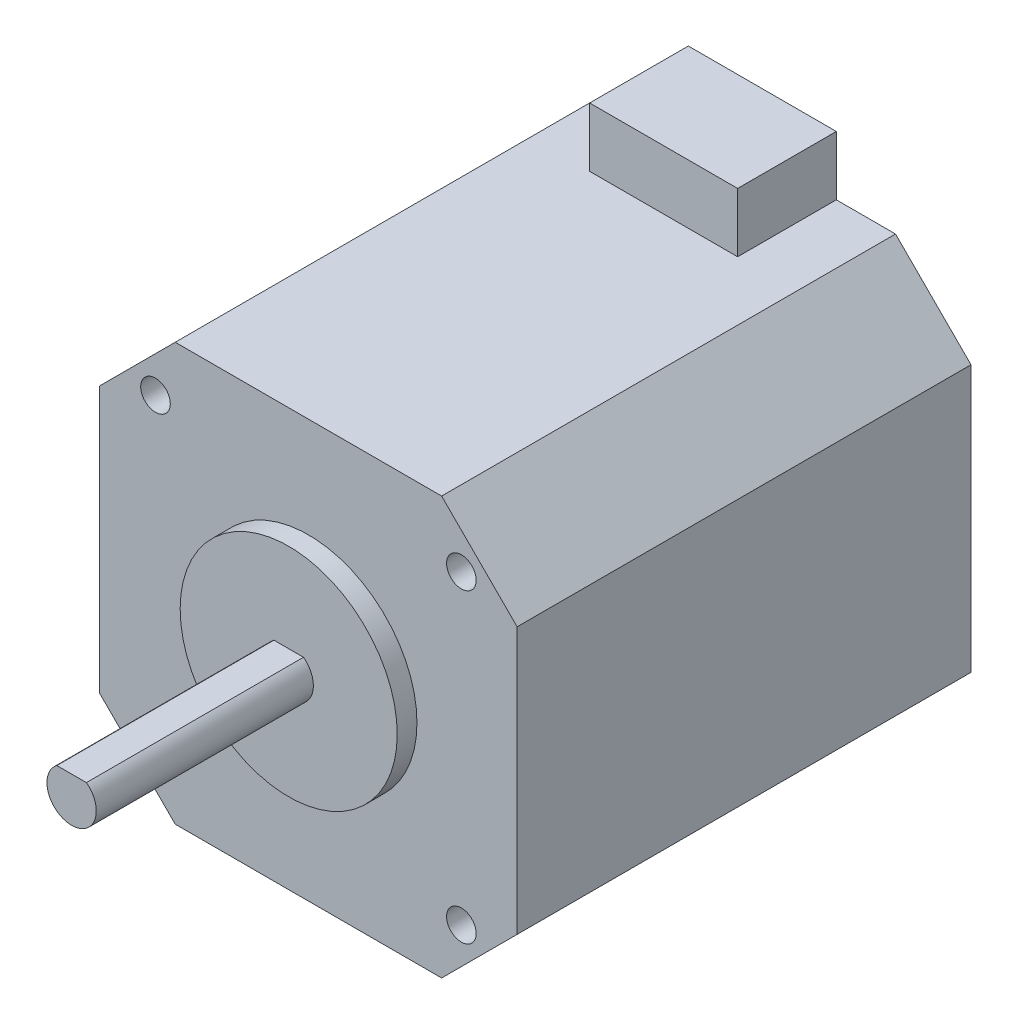
ISO-10303-21;
HEADER;
FILE_DESCRIPTION(('STEP AP214'),'2;1');
FILE_NAME('part.step','',(''),(''),'','','');
FILE_SCHEMA(('AUTOMOTIVE_DESIGN { 1 0 10303 214 1 1 1 1 }'));
ENDSEC;
DATA;
#1=APPLICATION_CONTEXT('core data for automotive mechanical design processes');
#2=APPLICATION_PROTOCOL_DEFINITION('international standard','automotive_design',2000,#1);
#3=PRODUCT_CONTEXT('',#1,'mechanical');
#4=PRODUCT('Part','Part','',(#3));
#5=PRODUCT_RELATED_PRODUCT_CATEGORY('part','',(#4));
#6=PRODUCT_DEFINITION_FORMATION('','',#4);
#7=PRODUCT_DEFINITION_CONTEXT('part definition',#1,'design');
#8=PRODUCT_DEFINITION('design','',#6,#7);
#9=PRODUCT_DEFINITION_SHAPE('','',#8);
#10=(LENGTH_UNIT() NAMED_UNIT(*) SI_UNIT(.MILLI.,.METRE.));
#11=(NAMED_UNIT(*) PLANE_ANGLE_UNIT() SI_UNIT($,.RADIAN.));
#12=(NAMED_UNIT(*) SI_UNIT($,.STERADIAN.) SOLID_ANGLE_UNIT());
#13=UNCERTAINTY_MEASURE_WITH_UNIT(LENGTH_MEASURE(1.E-05),#10,'distance_accuracy_value','');
#14=(GEOMETRIC_REPRESENTATION_CONTEXT(3) GLOBAL_UNCERTAINTY_ASSIGNED_CONTEXT((#13)) GLOBAL_UNIT_ASSIGNED_CONTEXT((#10,
#11,#12)) REPRESENTATION_CONTEXT('',''));
#15=CARTESIAN_POINT('',(0.,0.,0.));
#16=DIRECTION('',(0.,0.,1.));
#17=DIRECTION('',(1.,0.,0.));
#18=AXIS2_PLACEMENT_3D('',#15,#16,#17);
#19=CARTESIAN_POINT('',(7.65,42.3,46.));
#20=DIRECTION('',(0.,-1.,0.));
#21=DIRECTION('',(1.,0.,0.));
#22=AXIS2_PLACEMENT_3D('',#19,#20,#21);
#23=PLANE('',#22);
#24=DIRECTION('',(0.,0.,1.));
#25=VECTOR('',#24,1.);
#26=CARTESIAN_POINT('',(13.65,42.3,0.));
#27=LINE('',#26,#25);
#28=CARTESIAN_POINT('',(13.65,42.3,0.));
#29=VERTEX_POINT('',#28);
#30=CARTESIAN_POINT('',(13.65,42.3,10.));
#31=VERTEX_POINT('',#30);
#32=EDGE_CURVE('E62',#29,#31,#27,.T.);
#33=ORIENTED_EDGE('',*,*,#32,.F.);
#34=DIRECTION('',(-1.,0.,0.));
#35=VECTOR('',#34,1.);
#36=CARTESIAN_POINT('',(7.65,42.3,0.));
#37=LINE('',#36,#35);
#38=CARTESIAN_POINT('',(7.65,42.3,0.));
#39=VERTEX_POINT('',#38);
#40=EDGE_CURVE('E268',#29,#39,#37,.T.);
#41=ORIENTED_EDGE('',*,*,#40,.T.);
#42=DIRECTION('',(0.,0.,-1.));
#43=VECTOR('',#42,1.);
#44=CARTESIAN_POINT('',(7.65,42.3,46.));
#45=LINE('',#44,#43);
#46=CARTESIAN_POINT('',(7.65,42.3,46.));
#47=VERTEX_POINT('',#46);
#48=EDGE_CURVE('E291',#47,#39,#45,.T.);
#49=ORIENTED_EDGE('',*,*,#48,.F.);
#50=DIRECTION('',(-1.,0.,0.));
#51=VECTOR('',#50,1.);
#52=CARTESIAN_POINT('',(7.65,42.3,46.));
#53=LINE('',#52,#51);
#54=CARTESIAN_POINT('',(34.65,42.3,46.));
#55=VERTEX_POINT('',#54);
#56=EDGE_CURVE('E243',#55,#47,#53,.T.);
#57=ORIENTED_EDGE('',*,*,#56,.F.);
#58=DIRECTION('',(0.,0.,-1.));
#59=VECTOR('',#58,1.);
#60=CARTESIAN_POINT('',(34.65,42.3,46.));
#61=LINE('',#60,#59);
#62=CARTESIAN_POINT('',(34.65,42.3,0.));
#63=VERTEX_POINT('',#62);
#64=EDGE_CURVE('E295',#55,#63,#61,.T.);
#65=ORIENTED_EDGE('',*,*,#64,.T.);
#66=CARTESIAN_POINT('',(28.65,42.3,0.));
#67=VERTEX_POINT('',#66);
#68=EDGE_CURVE('E269',#63,#67,#37,.T.);
#69=ORIENTED_EDGE('',*,*,#68,.T.);
#70=DIRECTION('',(0.,0.,-1.));
#71=VECTOR('',#70,1.);
#72=CARTESIAN_POINT('',(28.65,42.3,0.));
#73=LINE('',#72,#71);
#74=CARTESIAN_POINT('',(28.65,42.3,10.));
#75=VERTEX_POINT('',#74);
#76=EDGE_CURVE('E162',#75,#67,#73,.T.);
#77=ORIENTED_EDGE('',*,*,#76,.F.);
#78=DIRECTION('',(1.,0.,0.));
#79=VECTOR('',#78,1.);
#80=CARTESIAN_POINT('',(13.65,42.3,10.));
#81=LINE('',#80,#79);
#82=EDGE_CURVE('E57',#31,#75,#81,.T.);
#83=ORIENTED_EDGE('',*,*,#82,.F.);
#84=EDGE_LOOP('',(#33,#41,#49,#57,#65,#69,#77,#83));
#85=FACE_BOUND('',#84,.T.);
#86=ADVANCED_FACE('F39',(#85),#23,.F.);
#87=CARTESIAN_POINT('',(34.65,0.,46.));
#88=DIRECTION('',(0.,1.,0.));
#89=DIRECTION('',(-1.,0.,0.));
#90=AXIS2_PLACEMENT_3D('',#87,#88,#89);
#91=PLANE('',#90);
#92=DIRECTION('',(1.,0.,0.));
#93=VECTOR('',#92,1.);
#94=CARTESIAN_POINT('',(34.65,0.,0.));
#95=LINE('',#94,#93);
#96=CARTESIAN_POINT('',(7.65,0.,0.));
#97=VERTEX_POINT('',#96);
#98=CARTESIAN_POINT('',(34.65,0.,0.));
#99=VERTEX_POINT('',#98);
#100=EDGE_CURVE('E225',#97,#99,#95,.T.);
#101=ORIENTED_EDGE('',*,*,#100,.T.);
#102=DIRECTION('',(0.,0.,-1.));
#103=VECTOR('',#102,1.);
#104=CARTESIAN_POINT('',(34.65,0.,46.));
#105=LINE('',#104,#103);
#106=CARTESIAN_POINT('',(34.65,0.,46.));
#107=VERTEX_POINT('',#106);
#108=EDGE_CURVE('E43',#107,#99,#105,.T.);
#109=ORIENTED_EDGE('',*,*,#108,.F.);
#110=DIRECTION('',(1.,0.,0.));
#111=VECTOR('',#110,1.);
#112=CARTESIAN_POINT('',(34.65,0.,46.));
#113=LINE('',#112,#111);
#114=CARTESIAN_POINT('',(7.65,0.,46.));
#115=VERTEX_POINT('',#114);
#116=EDGE_CURVE('E229',#115,#107,#113,.T.);
#117=ORIENTED_EDGE('',*,*,#116,.F.);
#118=DIRECTION('',(0.,0.,-1.));
#119=VECTOR('',#118,1.);
#120=CARTESIAN_POINT('',(7.65,0.,46.));
#121=LINE('',#120,#119);
#122=EDGE_CURVE('E255',#115,#97,#121,.T.);
#123=ORIENTED_EDGE('',*,*,#122,.T.);
#124=EDGE_LOOP('',(#101,#109,#117,#123));
#125=FACE_BOUND('',#124,.T.);
#126=ADVANCED_FACE('F41',(#125),#91,.F.);
#127=CARTESIAN_POINT('',(42.3,7.65,46.));
#128=DIRECTION('',(-0.707106781186548,0.707106781186547,0.));
#129=DIRECTION('',(-0.707106781186547,-0.707106781186548,0.));
#130=AXIS2_PLACEMENT_3D('',#127,#128,#129);
#131=PLANE('',#130);
#132=DIRECTION('',(0.707106781186547,0.707106781186548,0.));
#133=VECTOR('',#132,1.);
#134=CARTESIAN_POINT('',(42.3,7.65,0.));
#135=LINE('',#134,#133);
#136=CARTESIAN_POINT('',(42.3,7.65,0.));
#137=VERTEX_POINT('',#136);
#138=EDGE_CURVE('E259',#99,#137,#135,.T.);
#139=ORIENTED_EDGE('',*,*,#138,.T.);
#140=DIRECTION('',(0.,0.,-1.));
#141=VECTOR('',#140,1.);
#142=CARTESIAN_POINT('',(42.3,7.65,46.));
#143=LINE('',#142,#141);
#144=CARTESIAN_POINT('',(42.3,7.65,46.));
#145=VERTEX_POINT('',#144);
#146=EDGE_CURVE('E302',#145,#137,#143,.T.);
#147=ORIENTED_EDGE('',*,*,#146,.F.);
#148=DIRECTION('',(0.707106781186547,0.707106781186548,0.));
#149=VECTOR('',#148,1.);
#150=CARTESIAN_POINT('',(42.3,7.65,46.));
#151=LINE('',#150,#149);
#152=EDGE_CURVE('E233',#107,#145,#151,.T.);
#153=ORIENTED_EDGE('',*,*,#152,.F.);
#154=ORIENTED_EDGE('',*,*,#108,.T.);
#155=EDGE_LOOP('',(#139,#147,#153,#154));
#156=FACE_BOUND('',#155,.T.);
#157=ADVANCED_FACE('F313',(#156),#131,.F.);
#158=CARTESIAN_POINT('',(42.3,34.65,46.));
#159=DIRECTION('',(-1.,0.,0.));
#160=DIRECTION('',(0.,0.,1.));
#161=AXIS2_PLACEMENT_3D('',#158,#159,#160);
#162=PLANE('',#161);
#163=DIRECTION('',(0.,1.,0.));
#164=VECTOR('',#163,1.);
#165=CARTESIAN_POINT('',(42.3,34.65,0.));
#166=LINE('',#165,#164);
#167=CARTESIAN_POINT('',(42.3,34.65,0.));
#168=VERTEX_POINT('',#167);
#169=EDGE_CURVE('E262',#137,#168,#166,.T.);
#170=ORIENTED_EDGE('',*,*,#169,.T.);
#171=DIRECTION('',(0.,0.,-1.));
#172=VECTOR('',#171,1.);
#173=CARTESIAN_POINT('',(42.3,34.65,46.));
#174=LINE('',#173,#172);
#175=CARTESIAN_POINT('',(42.3,34.65,46.));
#176=VERTEX_POINT('',#175);
#177=EDGE_CURVE('E299',#176,#168,#174,.T.);
#178=ORIENTED_EDGE('',*,*,#177,.F.);
#179=DIRECTION('',(0.,1.,0.));
#180=VECTOR('',#179,1.);
#181=CARTESIAN_POINT('',(42.3,34.65,46.));
#182=LINE('',#181,#180);
#183=EDGE_CURVE('E237',#145,#176,#182,.T.);
#184=ORIENTED_EDGE('',*,*,#183,.F.);
#185=ORIENTED_EDGE('',*,*,#146,.T.);
#186=EDGE_LOOP('',(#170,#178,#184,#185));
#187=FACE_BOUND('',#186,.T.);
#188=ADVANCED_FACE('F325',(#187),#162,.F.);
#189=CARTESIAN_POINT('',(34.65,42.3,46.));
#190=DIRECTION('',(-0.707106781186548,-0.707106781186547,0.));
#191=DIRECTION('',(0.707106781186547,-0.707106781186548,0.));
#192=AXIS2_PLACEMENT_3D('',#189,#190,#191);
#193=PLANE('',#192);
#194=DIRECTION('',(-0.707106781186547,0.707106781186548,0.));
#195=VECTOR('',#194,1.);
#196=CARTESIAN_POINT('',(34.65,42.3,0.));
#197=LINE('',#196,#195);
#198=EDGE_CURVE('E265',#168,#63,#197,.T.);
#199=ORIENTED_EDGE('',*,*,#198,.T.);
#200=ORIENTED_EDGE('',*,*,#64,.F.);
#201=DIRECTION('',(-0.707106781186547,0.707106781186548,0.));
#202=VECTOR('',#201,1.);
#203=CARTESIAN_POINT('',(34.65,42.3,46.));
#204=LINE('',#203,#202);
#205=EDGE_CURVE('E240',#176,#55,#204,.T.);
#206=ORIENTED_EDGE('',*,*,#205,.F.);
#207=ORIENTED_EDGE('',*,*,#177,.T.);
#208=EDGE_LOOP('',(#199,#200,#206,#207));
#209=FACE_BOUND('',#208,.T.);
#210=ADVANCED_FACE('F328',(#209),#193,.F.);
#211=CARTESIAN_POINT('',(0.,34.65,46.));
#212=DIRECTION('',(0.707106781186547,-0.707106781186548,0.));
#213=DIRECTION('',(0.707106781186548,0.707106781186547,0.));
#214=AXIS2_PLACEMENT_3D('',#211,#212,#213);
#215=PLANE('',#214);
#216=DIRECTION('',(-0.707106781186548,-0.707106781186547,0.));
#217=VECTOR('',#216,1.);
#218=CARTESIAN_POINT('',(0.,34.65,0.));
#219=LINE('',#218,#217);
#220=CARTESIAN_POINT('',(0.,34.65,0.));
#221=VERTEX_POINT('',#220);
#222=EDGE_CURVE('E272',#39,#221,#219,.T.);
#223=ORIENTED_EDGE('',*,*,#222,.T.);
#224=DIRECTION('',(0.,0.,-1.));
#225=VECTOR('',#224,1.);
#226=CARTESIAN_POINT('',(0.,34.65,46.));
#227=LINE('',#226,#225);
#228=CARTESIAN_POINT('',(0.,34.65,46.));
#229=VERTEX_POINT('',#228);
#230=EDGE_CURVE('E287',#229,#221,#227,.T.);
#231=ORIENTED_EDGE('',*,*,#230,.F.);
#232=DIRECTION('',(-0.707106781186548,-0.707106781186547,0.));
#233=VECTOR('',#232,1.);
#234=CARTESIAN_POINT('',(0.,34.65,46.));
#235=LINE('',#234,#233);
#236=EDGE_CURVE('E246',#47,#229,#235,.T.);
#237=ORIENTED_EDGE('',*,*,#236,.F.);
#238=ORIENTED_EDGE('',*,*,#48,.T.);
#239=EDGE_LOOP('',(#223,#231,#237,#238));
#240=FACE_BOUND('',#239,.T.);
#241=ADVANCED_FACE('F344',(#240),#215,.F.);
#242=CARTESIAN_POINT('',(0.,7.65,46.));
#243=DIRECTION('',(1.,0.,0.));
#244=DIRECTION('',(0.,0.,-1.));
#245=AXIS2_PLACEMENT_3D('',#242,#243,#244);
#246=PLANE('',#245);
#247=DIRECTION('',(0.,-1.,0.));
#248=VECTOR('',#247,1.);
#249=CARTESIAN_POINT('',(0.,7.65,0.));
#250=LINE('',#249,#248);
#251=CARTESIAN_POINT('',(0.,7.65,0.));
#252=VERTEX_POINT('',#251);
#253=EDGE_CURVE('E275',#221,#252,#250,.T.);
#254=ORIENTED_EDGE('',*,*,#253,.T.);
#255=DIRECTION('',(0.,0.,-1.));
#256=VECTOR('',#255,1.);
#257=CARTESIAN_POINT('',(0.,7.65,46.));
#258=LINE('',#257,#256);
#259=CARTESIAN_POINT('',(0.,7.65,46.));
#260=VERTEX_POINT('',#259);
#261=EDGE_CURVE('E283',#260,#252,#258,.T.);
#262=ORIENTED_EDGE('',*,*,#261,.F.);
#263=DIRECTION('',(0.,-1.,0.));
#264=VECTOR('',#263,1.);
#265=CARTESIAN_POINT('',(0.,7.65,46.));
#266=LINE('',#265,#264);
#267=EDGE_CURVE('E249',#229,#260,#266,.T.);
#268=ORIENTED_EDGE('',*,*,#267,.F.);
#269=ORIENTED_EDGE('',*,*,#230,.T.);
#270=EDGE_LOOP('',(#254,#262,#268,#269));
#271=FACE_BOUND('',#270,.T.);
#272=ADVANCED_FACE('F340',(#271),#246,.F.);
#273=CARTESIAN_POINT('',(7.65,0.,46.));
#274=DIRECTION('',(0.707106781186548,0.707106781186548,0.));
#275=DIRECTION('',(-0.707106781186548,0.707106781186548,0.));
#276=AXIS2_PLACEMENT_3D('',#273,#274,#275);
#277=PLANE('',#276);
#278=DIRECTION('',(0.707106781186547,-0.707106781186547,0.));
#279=VECTOR('',#278,1.);
#280=CARTESIAN_POINT('',(7.65,0.,0.));
#281=LINE('',#280,#279);
#282=EDGE_CURVE('E234',#252,#97,#281,.T.);
#283=ORIENTED_EDGE('',*,*,#282,.T.);
#284=ORIENTED_EDGE('',*,*,#122,.F.);
#285=DIRECTION('',(0.707106781186547,-0.707106781186547,0.));
#286=VECTOR('',#285,1.);
#287=CARTESIAN_POINT('',(7.65,0.,46.));
#288=LINE('',#287,#286);
#289=EDGE_CURVE('E252',#260,#115,#288,.T.);
#290=ORIENTED_EDGE('',*,*,#289,.F.);
#291=ORIENTED_EDGE('',*,*,#261,.T.);
#292=EDGE_LOOP('',(#283,#284,#290,#291));
#293=FACE_BOUND('',#292,.T.);
#294=ADVANCED_FACE('F338',(#293),#277,.F.);
#295=CARTESIAN_POINT('',(0.,0.,46.));
#296=DIRECTION('',(0.,0.,-1.));
#297=DIRECTION('',(-1.,0.,0.));
#298=AXIS2_PLACEMENT_3D('',#295,#296,#297);
#299=PLANE('',#298);
#300=CARTESIAN_POINT('',(5.65,36.65,46.));
#301=DIRECTION('',(0.,0.,1.));
#302=DIRECTION('',(1.,0.,0.));
#303=AXIS2_PLACEMENT_3D('',#300,#301,#302);
#304=CIRCLE('',#303,1.5);
#305=CARTESIAN_POINT('',(7.15,36.65,46.));
#306=VERTEX_POINT('',#305);
#307=EDGE_CURVE('E186',#306,#306,#304,.T.);
#308=ORIENTED_EDGE('',*,*,#307,.F.);
#309=EDGE_LOOP('',(#308));
#310=FACE_BOUND('',#309,.T.);
#311=CARTESIAN_POINT('',(36.65,5.65,46.));
#312=DIRECTION('',(0.,0.,1.));
#313=DIRECTION('',(-1.,0.,0.));
#314=AXIS2_PLACEMENT_3D('',#311,#312,#313);
#315=CIRCLE('',#314,1.5);
#316=CARTESIAN_POINT('',(35.15,5.65,46.));
#317=VERTEX_POINT('',#316);
#318=EDGE_CURVE('E179',#317,#317,#315,.T.);
#319=ORIENTED_EDGE('',*,*,#318,.F.);
#320=EDGE_LOOP('',(#319));
#321=FACE_BOUND('',#320,.T.);
#322=CARTESIAN_POINT('',(36.65,36.65,46.));
#323=DIRECTION('',(0.,0.,1.));
#324=DIRECTION('',(-1.,0.,0.));
#325=AXIS2_PLACEMENT_3D('',#322,#323,#324);
#326=CIRCLE('',#325,1.5);
#327=CARTESIAN_POINT('',(35.15,36.65,46.));
#328=VERTEX_POINT('',#327);
#329=EDGE_CURVE('E166',#328,#328,#326,.T.);
#330=ORIENTED_EDGE('',*,*,#329,.F.);
#331=EDGE_LOOP('',(#330));
#332=FACE_BOUND('',#331,.T.);
#333=CARTESIAN_POINT('',(5.65,5.65,46.));
#334=DIRECTION('',(0.,0.,1.));
#335=DIRECTION('',(1.,0.,0.));
#336=AXIS2_PLACEMENT_3D('',#333,#334,#335);
#337=CIRCLE('',#336,1.5);
#338=CARTESIAN_POINT('',(7.15,5.65,46.));
#339=VERTEX_POINT('',#338);
#340=EDGE_CURVE('E185',#339,#339,#337,.T.);
#341=ORIENTED_EDGE('',*,*,#340,.F.);
#342=EDGE_LOOP('',(#341));
#343=FACE_BOUND('',#342,.T.);
#344=CARTESIAN_POINT('',(21.15,21.15,46.));
#345=DIRECTION('',(0.,0.,1.));
#346=DIRECTION('',(1.,0.,0.));
#347=AXIS2_PLACEMENT_3D('',#344,#345,#346);
#348=CIRCLE('',#347,11.);
#349=CARTESIAN_POINT('',(32.15,21.15,46.));
#350=VERTEX_POINT('',#349);
#351=EDGE_CURVE('E49',#350,#350,#348,.T.);
#352=ORIENTED_EDGE('',*,*,#351,.F.);
#353=EDGE_LOOP('',(#352));
#354=FACE_BOUND('',#353,.T.);
#355=ORIENTED_EDGE('',*,*,#116,.T.);
#356=ORIENTED_EDGE('',*,*,#152,.T.);
#357=ORIENTED_EDGE('',*,*,#183,.T.);
#358=ORIENTED_EDGE('',*,*,#205,.T.);
#359=ORIENTED_EDGE('',*,*,#56,.T.);
#360=ORIENTED_EDGE('',*,*,#236,.T.);
#361=ORIENTED_EDGE('',*,*,#267,.T.);
#362=ORIENTED_EDGE('',*,*,#289,.T.);
#363=EDGE_LOOP('',(#355,#356,#357,#358,#359,#360,#361,#362));
#364=FACE_BOUND('',#363,.T.);
#365=ADVANCED_FACE('F332',(#310,#321,#332,#343,#354,#364),#299,.F.);
#366=CARTESIAN_POINT('',(0.,0.,0.));
#367=DIRECTION('',(0.,0.,-1.));
#368=DIRECTION('',(-1.,0.,0.));
#369=AXIS2_PLACEMENT_3D('',#366,#367,#368);
#370=PLANE('',#369);
#371=ORIENTED_EDGE('',*,*,#100,.F.);
#372=ORIENTED_EDGE('',*,*,#282,.F.);
#373=ORIENTED_EDGE('',*,*,#253,.F.);
#374=ORIENTED_EDGE('',*,*,#222,.F.);
#375=ORIENTED_EDGE('',*,*,#40,.F.);
#376=DIRECTION('',(0.,-1.,0.));
#377=VECTOR('',#376,1.);
#378=CARTESIAN_POINT('',(13.65,48.3,0.));
#379=LINE('',#378,#377);
#380=CARTESIAN_POINT('',(13.65,48.3,0.));
#381=VERTEX_POINT('',#380);
#382=EDGE_CURVE('E352',#381,#29,#379,.T.);
#383=ORIENTED_EDGE('',*,*,#382,.F.);
#384=DIRECTION('',(-1.,0.,0.));
#385=VECTOR('',#384,1.);
#386=CARTESIAN_POINT('',(13.65,48.3,0.));
#387=LINE('',#386,#385);
#388=CARTESIAN_POINT('',(28.65,48.3,0.));
#389=VERTEX_POINT('',#388);
#390=EDGE_CURVE('E157',#389,#381,#387,.T.);
#391=ORIENTED_EDGE('',*,*,#390,.F.);
#392=DIRECTION('',(0.,-1.,0.));
#393=VECTOR('',#392,1.);
#394=CARTESIAN_POINT('',(28.65,48.3,0.));
#395=LINE('',#394,#393);
#396=EDGE_CURVE('E173',#389,#67,#395,.T.);
#397=ORIENTED_EDGE('',*,*,#396,.T.);
#398=ORIENTED_EDGE('',*,*,#68,.F.);
#399=ORIENTED_EDGE('',*,*,#198,.F.);
#400=ORIENTED_EDGE('',*,*,#169,.F.);
#401=ORIENTED_EDGE('',*,*,#138,.F.);
#402=EDGE_LOOP('',(#371,#372,#373,#374,#375,#383,#391,#397,#398,#399,#400,#401));
#403=FACE_BOUND('',#402,.T.);
#404=ADVANCED_FACE('F320',(#403),#370,.T.);
#405=CARTESIAN_POINT('',(21.15,21.15,48.));
#406=DIRECTION('',(0.,0.,-1.));
#407=DIRECTION('',(-1.,0.,0.));
#408=AXIS2_PLACEMENT_3D('',#405,#406,#407);
#409=CYLINDRICAL_SURFACE('',#408,11.);
#410=CARTESIAN_POINT('',(21.15,21.15,48.));
#411=DIRECTION('',(0.,0.,1.));
#412=DIRECTION('',(1.,0.,0.));
#413=AXIS2_PLACEMENT_3D('',#410,#411,#412);
#414=CIRCLE('',#413,11.);
#415=CARTESIAN_POINT('',(32.15,21.15,48.));
#416=VERTEX_POINT('',#415);
#417=EDGE_CURVE('E220',#416,#416,#414,.T.);
#418=ORIENTED_EDGE('',*,*,#417,.F.);
#419=EDGE_LOOP('',(#418));
#420=FACE_BOUND('',#419,.T.);
#421=ORIENTED_EDGE('',*,*,#351,.T.);
#422=EDGE_LOOP('',(#421));
#423=FACE_BOUND('',#422,.T.);
#424=ADVANCED_FACE('F430',(#420,#423),#409,.T.);
#425=CARTESIAN_POINT('',(21.15,21.15,48.));
#426=DIRECTION('',(0.,0.,1.));
#427=DIRECTION('',(1.,0.,0.));
#428=AXIS2_PLACEMENT_3D('',#425,#426,#427);
#429=PLANE('',#428);
#430=CARTESIAN_POINT('',(21.15,21.15,48.));
#431=DIRECTION('',(0.,0.,1.));
#432=DIRECTION('',(1.,0.,0.));
#433=AXIS2_PLACEMENT_3D('',#430,#431,#432);
#434=CIRCLE('',#433,2.5);
#435=CARTESIAN_POINT('',(19.65,23.15,48.));
#436=VERTEX_POINT('',#435);
#437=CARTESIAN_POINT('',(22.65,23.15,48.));
#438=VERTEX_POINT('',#437);
#439=EDGE_CURVE('E11',#436,#438,#434,.T.);
#440=ORIENTED_EDGE('',*,*,#439,.F.);
#441=DIRECTION('',(1.,0.,0.));
#442=VECTOR('',#441,1.);
#443=CARTESIAN_POINT('',(21.15,23.15,48.));
#444=LINE('',#443,#442);
#445=EDGE_CURVE('E205',#436,#438,#444,.T.);
#446=ORIENTED_EDGE('',*,*,#445,.T.);
#447=EDGE_LOOP('',(#440,#446));
#448=FACE_BOUND('',#447,.T.);
#449=ORIENTED_EDGE('',*,*,#417,.T.);
#450=EDGE_LOOP('',(#449));
#451=FACE_BOUND('',#450,.T.);
#452=ADVANCED_FACE('F437',(#448,#451),#429,.T.);
#453=CARTESIAN_POINT('',(21.15,21.15,70.));
#454=DIRECTION('',(0.,0.,-1.));
#455=DIRECTION('',(-1.,0.,0.));
#456=AXIS2_PLACEMENT_3D('',#453,#454,#455);
#457=CYLINDRICAL_SURFACE('',#456,2.5);
#458=CARTESIAN_POINT('',(21.15,21.15,70.));
#459=DIRECTION('',(0.,0.,1.));
#460=DIRECTION('',(1.,0.,0.));
#461=AXIS2_PLACEMENT_3D('',#458,#459,#460);
#462=CIRCLE('',#461,2.5);
#463=CARTESIAN_POINT('',(19.65,23.15,70.));
#464=VERTEX_POINT('',#463);
#465=CARTESIAN_POINT('',(22.65,23.15,70.));
#466=VERTEX_POINT('',#465);
#467=EDGE_CURVE('E214',#464,#466,#462,.T.);
#468=ORIENTED_EDGE('',*,*,#467,.F.);
#469=DIRECTION('',(0.,0.,1.));
#470=VECTOR('',#469,1.);
#471=CARTESIAN_POINT('',(19.65,23.15,48.));
#472=LINE('',#471,#470);
#473=EDGE_CURVE('E211',#436,#464,#472,.T.);
#474=ORIENTED_EDGE('',*,*,#473,.F.);
#475=ORIENTED_EDGE('',*,*,#439,.T.);
#476=DIRECTION('',(0.,0.,1.));
#477=VECTOR('',#476,1.);
#478=CARTESIAN_POINT('',(22.65,23.15,48.));
#479=LINE('',#478,#477);
#480=EDGE_CURVE('E208',#438,#466,#479,.T.);
#481=ORIENTED_EDGE('',*,*,#480,.T.);
#482=EDGE_LOOP('',(#468,#474,#475,#481));
#483=FACE_BOUND('',#482,.T.);
#484=ADVANCED_FACE('F445',(#483),#457,.T.);
#485=CARTESIAN_POINT('',(21.15,21.15,70.));
#486=DIRECTION('',(0.,0.,1.));
#487=DIRECTION('',(1.,0.,0.));
#488=AXIS2_PLACEMENT_3D('',#485,#486,#487);
#489=PLANE('',#488);
#490=DIRECTION('',(1.,0.,0.));
#491=VECTOR('',#490,1.);
#492=CARTESIAN_POINT('',(21.15,23.15,70.));
#493=LINE('',#492,#491);
#494=EDGE_CURVE('E201',#464,#466,#493,.T.);
#495=ORIENTED_EDGE('',*,*,#494,.F.);
#496=ORIENTED_EDGE('',*,*,#467,.T.);
#497=EDGE_LOOP('',(#495,#496));
#498=FACE_BOUND('',#497,.T.);
#499=ADVANCED_FACE('F453',(#498),#489,.T.);
#500=CARTESIAN_POINT('',(21.15,23.15,48.));
#501=DIRECTION('',(0.,-1.,0.));
#502=DIRECTION('',(0.,0.,-1.));
#503=AXIS2_PLACEMENT_3D('',#500,#501,#502);
#504=PLANE('',#503);
#505=ORIENTED_EDGE('',*,*,#494,.T.);
#506=ORIENTED_EDGE('',*,*,#480,.F.);
#507=ORIENTED_EDGE('',*,*,#445,.F.);
#508=ORIENTED_EDGE('',*,*,#473,.T.);
#509=EDGE_LOOP('',(#505,#506,#507,#508));
#510=FACE_BOUND('',#509,.T.);
#511=ADVANCED_FACE('F461',(#510),#504,.F.);
#512=CARTESIAN_POINT('',(5.65,5.65,41.5));
#513=DIRECTION('',(0.,0.,1.));
#514=DIRECTION('',(1.,0.,0.));
#515=AXIS2_PLACEMENT_3D('',#512,#513,#514);
#516=CYLINDRICAL_SURFACE('',#515,1.5);
#517=CARTESIAN_POINT('',(5.65,5.65,41.5));
#518=DIRECTION('',(0.,0.,1.));
#519=DIRECTION('',(1.,0.,0.));
#520=AXIS2_PLACEMENT_3D('',#517,#518,#519);
#521=CIRCLE('',#520,1.5);
#522=CARTESIAN_POINT('',(7.15,5.65,41.5));
#523=VERTEX_POINT('',#522);
#524=EDGE_CURVE('E197',#523,#523,#521,.T.);
#525=ORIENTED_EDGE('',*,*,#524,.F.);
#526=EDGE_LOOP('',(#525));
#527=FACE_BOUND('',#526,.T.);
#528=ORIENTED_EDGE('',*,*,#340,.T.);
#529=EDGE_LOOP('',(#528));
#530=FACE_BOUND('',#529,.T.);
#531=ADVANCED_FACE('F468',(#527,#530),#516,.F.);
#532=CARTESIAN_POINT('',(5.65,5.65,41.5));
#533=DIRECTION('',(0.,0.,1.));
#534=DIRECTION('',(1.,0.,0.));
#535=AXIS2_PLACEMENT_3D('',#532,#533,#534);
#536=PLANE('',#535);
#537=ORIENTED_EDGE('',*,*,#524,.T.);
#538=EDGE_LOOP('',(#537));
#539=FACE_BOUND('',#538,.T.);
#540=ADVANCED_FACE('F475',(#539),#536,.T.);
#541=CARTESIAN_POINT('',(36.65,36.65,41.5));
#542=DIRECTION('',(0.,0.,1.));
#543=DIRECTION('',(1.,0.,0.));
#544=AXIS2_PLACEMENT_3D('',#541,#542,#543);
#545=CYLINDRICAL_SURFACE('',#544,1.5);
#546=CARTESIAN_POINT('',(36.65,36.65,41.5));
#547=DIRECTION('',(0.,0.,1.));
#548=DIRECTION('',(-1.,0.,0.));
#549=AXIS2_PLACEMENT_3D('',#546,#547,#548);
#550=CIRCLE('',#549,1.5);
#551=CARTESIAN_POINT('',(35.15,36.65,41.5));
#552=VERTEX_POINT('',#551);
#553=EDGE_CURVE('E171',#552,#552,#550,.T.);
#554=ORIENTED_EDGE('',*,*,#553,.F.);
#555=EDGE_LOOP('',(#554));
#556=FACE_BOUND('',#555,.T.);
#557=ORIENTED_EDGE('',*,*,#329,.T.);
#558=EDGE_LOOP('',(#557));
#559=FACE_BOUND('',#558,.T.);
#560=ADVANCED_FACE('F483',(#556,#559),#545,.F.);
#561=CARTESIAN_POINT('',(36.65,36.65,41.5));
#562=DIRECTION('',(0.,0.,-1.));
#563=DIRECTION('',(-1.,0.,0.));
#564=AXIS2_PLACEMENT_3D('',#561,#562,#563);
#565=PLANE('',#564);
#566=ORIENTED_EDGE('',*,*,#553,.T.);
#567=EDGE_LOOP('',(#566));
#568=FACE_BOUND('',#567,.T.);
#569=ADVANCED_FACE('F491',(#568),#565,.F.);
#570=CARTESIAN_POINT('',(36.65,5.65,41.5));
#571=DIRECTION('',(0.,0.,1.));
#572=DIRECTION('',(1.,0.,0.));
#573=AXIS2_PLACEMENT_3D('',#570,#571,#572);
#574=CYLINDRICAL_SURFACE('',#573,1.5);
#575=CARTESIAN_POINT('',(36.65,5.65,41.5));
#576=DIRECTION('',(0.,0.,1.));
#577=DIRECTION('',(-1.,0.,0.));
#578=AXIS2_PLACEMENT_3D('',#575,#576,#577);
#579=CIRCLE('',#578,1.5);
#580=CARTESIAN_POINT('',(35.15,5.65,41.5));
#581=VERTEX_POINT('',#580);
#582=EDGE_CURVE('E190',#581,#581,#579,.T.);
#583=ORIENTED_EDGE('',*,*,#582,.F.);
#584=EDGE_LOOP('',(#583));
#585=FACE_BOUND('',#584,.T.);
#586=ORIENTED_EDGE('',*,*,#318,.T.);
#587=EDGE_LOOP('',(#586));
#588=FACE_BOUND('',#587,.T.);
#589=ADVANCED_FACE('F499',(#585,#588),#574,.F.);
#590=CARTESIAN_POINT('',(36.65,5.65,41.5));
#591=DIRECTION('',(0.,0.,-1.));
#592=DIRECTION('',(-1.,0.,0.));
#593=AXIS2_PLACEMENT_3D('',#590,#591,#592);
#594=PLANE('',#593);
#595=ORIENTED_EDGE('',*,*,#582,.T.);
#596=EDGE_LOOP('',(#595));
#597=FACE_BOUND('',#596,.T.);
#598=ADVANCED_FACE('F507',(#597),#594,.F.);
#599=CARTESIAN_POINT('',(5.65,36.65,41.5));
#600=DIRECTION('',(0.,0.,1.));
#601=DIRECTION('',(1.,0.,0.));
#602=AXIS2_PLACEMENT_3D('',#599,#600,#601);
#603=CYLINDRICAL_SURFACE('',#602,1.5);
#604=CARTESIAN_POINT('',(5.65,36.65,41.5));
#605=DIRECTION('',(0.,0.,1.));
#606=DIRECTION('',(1.,0.,0.));
#607=AXIS2_PLACEMENT_3D('',#604,#605,#606);
#608=CIRCLE('',#607,1.5);
#609=CARTESIAN_POINT('',(7.15,36.65,41.5));
#610=VERTEX_POINT('',#609);
#611=EDGE_CURVE('E181',#610,#610,#608,.T.);
#612=ORIENTED_EDGE('',*,*,#611,.F.);
#613=EDGE_LOOP('',(#612));
#614=FACE_BOUND('',#613,.T.);
#615=ORIENTED_EDGE('',*,*,#307,.T.);
#616=EDGE_LOOP('',(#615));
#617=FACE_BOUND('',#616,.T.);
#618=ADVANCED_FACE('F515',(#614,#617),#603,.F.);
#619=CARTESIAN_POINT('',(5.65,36.65,41.5));
#620=DIRECTION('',(0.,0.,1.));
#621=DIRECTION('',(1.,0.,0.));
#622=AXIS2_PLACEMENT_3D('',#619,#620,#621);
#623=PLANE('',#622);
#624=ORIENTED_EDGE('',*,*,#611,.T.);
#625=EDGE_LOOP('',(#624));
#626=FACE_BOUND('',#625,.T.);
#627=ADVANCED_FACE('F523',(#626),#623,.T.);
#628=CARTESIAN_POINT('',(13.65,48.3,0.));
#629=DIRECTION('',(1.,0.,0.));
#630=DIRECTION('',(0.,1.,0.));
#631=AXIS2_PLACEMENT_3D('',#628,#629,#630);
#632=PLANE('',#631);
#633=ORIENTED_EDGE('',*,*,#32,.T.);
#634=DIRECTION('',(0.,-1.,0.));
#635=VECTOR('',#634,1.);
#636=CARTESIAN_POINT('',(13.65,48.3,10.));
#637=LINE('',#636,#635);
#638=CARTESIAN_POINT('',(13.65,48.3,10.));
#639=VERTEX_POINT('',#638);
#640=EDGE_CURVE('E145',#639,#31,#637,.T.);
#641=ORIENTED_EDGE('',*,*,#640,.F.);
#642=DIRECTION('',(0.,0.,1.));
#643=VECTOR('',#642,1.);
#644=CARTESIAN_POINT('',(13.65,48.3,0.));
#645=LINE('',#644,#643);
#646=EDGE_CURVE('E152',#381,#639,#645,.T.);
#647=ORIENTED_EDGE('',*,*,#646,.F.);
#648=ORIENTED_EDGE('',*,*,#382,.T.);
#649=EDGE_LOOP('',(#633,#641,#647,#648));
#650=FACE_BOUND('',#649,.T.);
#651=ADVANCED_FACE('F164',(#650),#632,.F.);
#652=CARTESIAN_POINT('',(13.65,48.3,10.));
#653=DIRECTION('',(0.,0.,-1.));
#654=DIRECTION('',(-1.,0.,0.));
#655=AXIS2_PLACEMENT_3D('',#652,#653,#654);
#656=PLANE('',#655);
#657=ORIENTED_EDGE('',*,*,#82,.T.);
#658=DIRECTION('',(0.,-1.,0.));
#659=VECTOR('',#658,1.);
#660=CARTESIAN_POINT('',(28.65,48.3,10.));
#661=LINE('',#660,#659);
#662=CARTESIAN_POINT('',(28.65,48.3,10.));
#663=VERTEX_POINT('',#662);
#664=EDGE_CURVE('E147',#663,#75,#661,.T.);
#665=ORIENTED_EDGE('',*,*,#664,.F.);
#666=DIRECTION('',(1.,0.,0.));
#667=VECTOR('',#666,1.);
#668=CARTESIAN_POINT('',(13.65,48.3,10.));
#669=LINE('',#668,#667);
#670=EDGE_CURVE('E141',#639,#663,#669,.T.);
#671=ORIENTED_EDGE('',*,*,#670,.F.);
#672=ORIENTED_EDGE('',*,*,#640,.T.);
#673=EDGE_LOOP('',(#657,#665,#671,#672));
#674=FACE_BOUND('',#673,.T.);
#675=ADVANCED_FACE('F143',(#674),#656,.F.);
#676=CARTESIAN_POINT('',(28.65,48.3,0.));
#677=DIRECTION('',(-1.,0.,0.));
#678=DIRECTION('',(0.,-1.,0.));
#679=AXIS2_PLACEMENT_3D('',#676,#677,#678);
#680=PLANE('',#679);
#681=ORIENTED_EDGE('',*,*,#76,.T.);
#682=ORIENTED_EDGE('',*,*,#396,.F.);
#683=DIRECTION('',(0.,0.,-1.));
#684=VECTOR('',#683,1.);
#685=CARTESIAN_POINT('',(28.65,48.3,0.));
#686=LINE('',#685,#684);
#687=EDGE_CURVE('E151',#663,#389,#686,.T.);
#688=ORIENTED_EDGE('',*,*,#687,.F.);
#689=ORIENTED_EDGE('',*,*,#664,.T.);
#690=EDGE_LOOP('',(#681,#682,#688,#689));
#691=FACE_BOUND('',#690,.T.);
#692=ADVANCED_FACE('F365',(#691),#680,.F.);
#693=CARTESIAN_POINT('',(0.,48.3,0.));
#694=DIRECTION('',(0.,1.,0.));
#695=DIRECTION('',(0.,0.,1.));
#696=AXIS2_PLACEMENT_3D('',#693,#694,#695);
#697=PLANE('',#696);
#698=ORIENTED_EDGE('',*,*,#646,.T.);
#699=ORIENTED_EDGE('',*,*,#670,.T.);
#700=ORIENTED_EDGE('',*,*,#687,.T.);
#701=ORIENTED_EDGE('',*,*,#390,.T.);
#702=EDGE_LOOP('',(#698,#699,#700,#701));
#703=FACE_BOUND('',#702,.T.);
#704=ADVANCED_FACE('F155',(#703),#697,.T.);
#705=CLOSED_SHELL('',(#86,#126,#157,#188,#210,#241,#272,#294,#365,#404,#424,#452,#484,#499,#511,
#531,#540,#560,#569,#589,#598,#618,#627,#651,#675,#692,#704));
#706=MANIFOLD_SOLID_BREP('B2',#705);
#707=ADVANCED_BREP_SHAPE_REPRESENTATION('',(#18,#706),#14);
#708=SHAPE_DEFINITION_REPRESENTATION(#9,#707);
ENDSEC;
END-ISO-10303-21;
